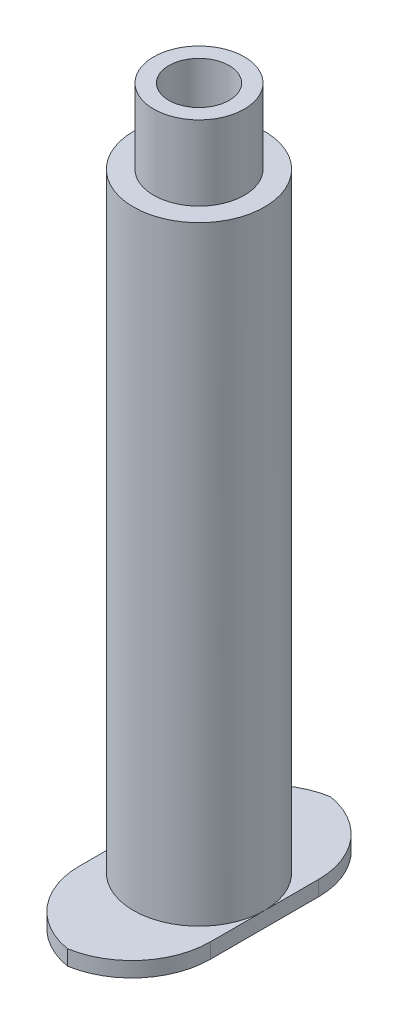
ISO-10303-21;
HEADER;
FILE_DESCRIPTION(('STEP AP214'),'2;1');
FILE_NAME('part.step','',(''),(''),'','','');
FILE_SCHEMA(('AUTOMOTIVE_DESIGN { 1 0 10303 214 1 1 1 1 }'));
ENDSEC;
DATA;
#1=APPLICATION_CONTEXT('core data for automotive mechanical design processes');
#2=APPLICATION_PROTOCOL_DEFINITION('international standard','automotive_design',2000,#1);
#3=PRODUCT_CONTEXT('',#1,'mechanical');
#4=PRODUCT('Part','Part','',(#3));
#5=PRODUCT_RELATED_PRODUCT_CATEGORY('part','',(#4));
#6=PRODUCT_DEFINITION_FORMATION('','',#4);
#7=PRODUCT_DEFINITION_CONTEXT('part definition',#1,'design');
#8=PRODUCT_DEFINITION('design','',#6,#7);
#9=PRODUCT_DEFINITION_SHAPE('','',#8);
#10=(LENGTH_UNIT() NAMED_UNIT(*) SI_UNIT(.MILLI.,.METRE.));
#11=(NAMED_UNIT(*) PLANE_ANGLE_UNIT() SI_UNIT($,.RADIAN.));
#12=(NAMED_UNIT(*) SI_UNIT($,.STERADIAN.) SOLID_ANGLE_UNIT());
#13=UNCERTAINTY_MEASURE_WITH_UNIT(LENGTH_MEASURE(1.E-05),#10,'distance_accuracy_value','');
#14=(GEOMETRIC_REPRESENTATION_CONTEXT(3) GLOBAL_UNCERTAINTY_ASSIGNED_CONTEXT((#13)) GLOBAL_UNIT_ASSIGNED_CONTEXT((#10,
#11,#12)) REPRESENTATION_CONTEXT('',''));
#15=CARTESIAN_POINT('',(0.,0.,0.));
#16=DIRECTION('',(0.,0.,1.));
#17=DIRECTION('',(1.,0.,0.));
#18=AXIS2_PLACEMENT_3D('',#15,#16,#17);
#19=CARTESIAN_POINT('',(0.,62.,0.));
#20=DIRECTION('',(0.,-1.,0.));
#21=DIRECTION('',(0.,0.,-1.));
#22=AXIS2_PLACEMENT_3D('',#19,#20,#21);
#23=CYLINDRICAL_SURFACE('',#22,6.67);
#24=CARTESIAN_POINT('',(0.,62.,0.));
#25=DIRECTION('',(0.,1.,0.));
#26=DIRECTION('',(0.,0.,1.));
#27=AXIS2_PLACEMENT_3D('',#24,#25,#26);
#28=CIRCLE('',#27,6.67);
#29=CARTESIAN_POINT('',(0.,62.,6.67));
#30=VERTEX_POINT('',#29);
#31=EDGE_CURVE('E118',#30,#30,#28,.T.);
#32=ORIENTED_EDGE('',*,*,#31,.F.);
#33=EDGE_LOOP('',(#32));
#34=FACE_BOUND('',#33,.T.);
#35=CARTESIAN_POINT('',(0.,0.,0.));
#36=DIRECTION('',(0.,1.,0.));
#37=DIRECTION('',(0.,0.,1.));
#38=AXIS2_PLACEMENT_3D('',#35,#36,#37);
#39=CIRCLE('',#38,6.67);
#40=CARTESIAN_POINT('',(6.67,0.,0.));
#41=VERTEX_POINT('',#40);
#42=CARTESIAN_POINT('',(-6.67,0.,0.));
#43=VERTEX_POINT('',#42);
#44=EDGE_CURVE('E109',#41,#43,#39,.T.);
#45=ORIENTED_EDGE('',*,*,#44,.T.);
#46=EDGE_CURVE('E103',#43,#41,#39,.T.);
#47=ORIENTED_EDGE('',*,*,#46,.T.);
#48=EDGE_LOOP('',(#45,#47));
#49=FACE_BOUND('',#48,.T.);
#50=ADVANCED_FACE('F33',(#34,#49),#23,.T.);
#51=CARTESIAN_POINT('',(0.,62.,0.));
#52=DIRECTION('',(0.,1.,0.));
#53=DIRECTION('',(0.,0.,1.));
#54=AXIS2_PLACEMENT_3D('',#51,#52,#53);
#55=PLANE('',#54);
#56=CARTESIAN_POINT('',(0.,62.,0.));
#57=DIRECTION('',(0.,1.,0.));
#58=DIRECTION('',(0.,0.,1.));
#59=AXIS2_PLACEMENT_3D('',#56,#57,#58);
#60=CIRCLE('',#59,4.61);
#61=CARTESIAN_POINT('',(0.,62.,-4.61));
#62=VERTEX_POINT('',#61);
#63=EDGE_CURVE('E120',#62,#62,#60,.T.);
#64=ORIENTED_EDGE('',*,*,#63,.F.);
#65=EDGE_LOOP('',(#64));
#66=FACE_BOUND('',#65,.T.);
#67=ORIENTED_EDGE('',*,*,#31,.T.);
#68=EDGE_LOOP('',(#67));
#69=FACE_BOUND('',#68,.T.);
#70=ADVANCED_FACE('F187',(#66,#69),#55,.T.);
#71=CARTESIAN_POINT('',(0.,69.6,0.));
#72=DIRECTION('',(0.,-1.,0.));
#73=DIRECTION('',(0.,0.,-1.));
#74=AXIS2_PLACEMENT_3D('',#71,#72,#73);
#75=CYLINDRICAL_SURFACE('',#74,4.61);
#76=CARTESIAN_POINT('',(0.,69.6,0.));
#77=DIRECTION('',(0.,1.,0.));
#78=DIRECTION('',(0.,0.,1.));
#79=AXIS2_PLACEMENT_3D('',#76,#77,#78);
#80=CIRCLE('',#79,4.61);
#81=CARTESIAN_POINT('',(0.,69.6,-4.61));
#82=VERTEX_POINT('',#81);
#83=EDGE_CURVE('E110',#82,#82,#80,.T.);
#84=CARTESIAN_POINT('',(0.,69.6,-4.61));
#85=CARTESIAN_POINT('',(0.,69.5208333333333,-4.61));
#86=CARTESIAN_POINT('',(0.,69.4416666666666,-4.61));
#87=CARTESIAN_POINT('',(0.,69.2833333333333,-4.61));
#88=CARTESIAN_POINT('',(0.,69.2041666666667,-4.61));
#89=CARTESIAN_POINT('',(0.,69.0458333333333,-4.61));
#90=CARTESIAN_POINT('',(0.,68.9666666666667,-4.61));
#91=CARTESIAN_POINT('',(0.,68.8083333333333,-4.61));
#92=CARTESIAN_POINT('',(0.,68.7291666666667,-4.61));
#93=CARTESIAN_POINT('',(0.,68.5708333333333,-4.61));
#94=CARTESIAN_POINT('',(0.,68.4916666666667,-4.61));
#95=CARTESIAN_POINT('',(0.,68.3333333333333,-4.61));
#96=CARTESIAN_POINT('',(0.,68.2541666666667,-4.61));
#97=CARTESIAN_POINT('',(0.,68.0958333333333,-4.61));
#98=CARTESIAN_POINT('',(0.,68.0166666666667,-4.61));
#99=CARTESIAN_POINT('',(0.,67.8583333333333,-4.61));
#100=CARTESIAN_POINT('',(0.,67.7791666666667,-4.61));
#101=CARTESIAN_POINT('',(0.,67.6208333333333,-4.61));
#102=CARTESIAN_POINT('',(0.,67.5416666666667,-4.61));
#103=CARTESIAN_POINT('',(0.,67.3833333333333,-4.61));
#104=CARTESIAN_POINT('',(0.,67.3041666666667,-4.61));
#105=CARTESIAN_POINT('',(0.,67.1458333333333,-4.61));
#106=CARTESIAN_POINT('',(0.,67.0666666666667,-4.61));
#107=CARTESIAN_POINT('',(0.,66.9083333333333,-4.61));
#108=CARTESIAN_POINT('',(0.,66.8291666666667,-4.61));
#109=CARTESIAN_POINT('',(0.,66.6708333333333,-4.61));
#110=CARTESIAN_POINT('',(0.,66.5916666666667,-4.61));
#111=CARTESIAN_POINT('',(0.,66.4333333333333,-4.61));
#112=CARTESIAN_POINT('',(0.,66.3541666666667,-4.61));
#113=CARTESIAN_POINT('',(0.,66.1958333333333,-4.61));
#114=CARTESIAN_POINT('',(0.,66.1166666666667,-4.61));
#115=CARTESIAN_POINT('',(0.,65.9583333333333,-4.61));
#116=CARTESIAN_POINT('',(0.,65.8791666666666,-4.61));
#117=CARTESIAN_POINT('',(0.,65.7208333333333,-4.61));
#118=CARTESIAN_POINT('',(0.,65.6416666666667,-4.61));
#119=CARTESIAN_POINT('',(0.,65.4833333333333,-4.61));
#120=CARTESIAN_POINT('',(0.,65.4041666666667,-4.61));
#121=CARTESIAN_POINT('',(0.,65.2458333333333,-4.61));
#122=CARTESIAN_POINT('',(0.,65.1666666666667,-4.61));
#123=CARTESIAN_POINT('',(0.,65.0083333333333,-4.61));
#124=CARTESIAN_POINT('',(0.,64.9291666666667,-4.61));
#125=CARTESIAN_POINT('',(0.,64.7708333333333,-4.61));
#126=CARTESIAN_POINT('',(0.,64.6916666666667,-4.61));
#127=CARTESIAN_POINT('',(0.,64.5333333333333,-4.61));
#128=CARTESIAN_POINT('',(0.,64.4541666666667,-4.61));
#129=CARTESIAN_POINT('',(0.,64.2958333333333,-4.61));
#130=CARTESIAN_POINT('',(0.,64.2166666666667,-4.61));
#131=CARTESIAN_POINT('',(0.,64.0583333333333,-4.61));
#132=CARTESIAN_POINT('',(0.,63.9791666666667,-4.61));
#133=CARTESIAN_POINT('',(0.,63.8208333333333,-4.61));
#134=CARTESIAN_POINT('',(0.,63.7416666666667,-4.61));
#135=CARTESIAN_POINT('',(0.,63.5833333333333,-4.61));
#136=CARTESIAN_POINT('',(0.,63.5041666666667,-4.61));
#137=CARTESIAN_POINT('',(0.,63.3458333333333,-4.61));
#138=CARTESIAN_POINT('',(0.,63.2666666666667,-4.61));
#139=CARTESIAN_POINT('',(0.,63.1083333333333,-4.61));
#140=CARTESIAN_POINT('',(0.,63.0291666666667,-4.61));
#141=CARTESIAN_POINT('',(0.,62.8708333333333,-4.61));
#142=CARTESIAN_POINT('',(0.,62.7916666666667,-4.61));
#143=CARTESIAN_POINT('',(0.,62.6333333333333,-4.61));
#144=CARTESIAN_POINT('',(0.,62.5541666666667,-4.61));
#145=CARTESIAN_POINT('',(0.,62.3958333333333,-4.61));
#146=CARTESIAN_POINT('',(0.,62.3166666666667,-4.61));
#147=CARTESIAN_POINT('',(0.,62.1583333333333,-4.61));
#148=CARTESIAN_POINT('',(0.,62.0791666666667,-4.61));
#149=CARTESIAN_POINT('',(0.,62.,-4.61));
#150=B_SPLINE_CURVE_WITH_KNOTS('',3,(#84,#85,#86,#87,#88,#89,#90,#91,#92,#93,#94,#95,#96,#97,
#98,#99,#100,#101,#102,#103,#104,#105,#106,#107,#108,#109,#110,#111,#112,#113,#114,#115,#116,
#117,#118,#119,#120,#121,#122,#123,#124,#125,#126,#127,#128,#129,#130,#131,#132,#133,#134,#135,
#136,#137,#138,#139,#140,#141,#142,#143,#144,#145,#146,#147,#148,#149),.UNSPECIFIED.,.F.,.F.,(4,
2,2,2,2,2,2,2,2,2,2,2,2,2,2,2,2,2,2,2,2,2,2,2,2,2,2,2,2,2,2,2,4),(0.,0.237499999999988,
0.474999999999989,0.712499999999991,0.949999999999993,1.18749999999999,1.425,1.6625,
1.89999999999999,2.13749999999999,2.37499999999999,2.61249999999999,2.84999999999999,
3.08749999999999,3.32499999999999,3.5625,3.79999999999998,4.03749999999999,4.27499999999999,
4.51249999999999,4.74999999999999,4.98749999999999,5.22499999999999,5.4625,5.69999999999998,
5.93749999999998,6.17499999999999,6.41249999999999,6.64999999999999,6.88749999999999,
7.12499999999999,7.36249999999999,7.59999999999999),.UNSPECIFIED.);
#151=EDGE_CURVE('BSEAM185',#82,#62,#150,.T.);
#152=ORIENTED_EDGE('',*,*,#83,.F.);
#153=ORIENTED_EDGE('',*,*,#63,.T.);
#154=ORIENTED_EDGE('',*,*,#151,.T.);
#155=ORIENTED_EDGE('',*,*,#151,.F.);
#156=EDGE_LOOP('',(#152,#154,#153,#155));
#157=FACE_BOUND('',#156,.T.);
#158=ADVANCED_FACE('F185',(#157),#75,.T.);
#159=CARTESIAN_POINT('',(0.,69.6,0.));
#160=DIRECTION('',(0.,1.,0.));
#161=DIRECTION('',(0.,0.,1.));
#162=AXIS2_PLACEMENT_3D('',#159,#160,#161);
#163=PLANE('',#162);
#164=CARTESIAN_POINT('',(0.,69.6,0.));
#165=DIRECTION('',(0.,1.,0.));
#166=DIRECTION('',(0.,0.,1.));
#167=AXIS2_PLACEMENT_3D('',#164,#165,#166);
#168=CIRCLE('',#167,3.07);
#169=CARTESIAN_POINT('',(0.,69.6,3.07));
#170=VERTEX_POINT('',#169);
#171=EDGE_CURVE('E128',#170,#170,#168,.T.);
#172=ORIENTED_EDGE('',*,*,#171,.F.);
#173=EDGE_LOOP('',(#172));
#174=FACE_BOUND('',#173,.T.);
#175=ORIENTED_EDGE('',*,*,#83,.T.);
#176=EDGE_LOOP('',(#175));
#177=FACE_BOUND('',#176,.T.);
#178=ADVANCED_FACE('F272',(#174,#177),#163,.T.);
#179=CARTESIAN_POINT('',(0.,60.6,0.));
#180=DIRECTION('',(0.,-1.,0.));
#181=DIRECTION('',(0.,0.,-1.));
#182=AXIS2_PLACEMENT_3D('',#179,#180,#181);
#183=CYLINDRICAL_SURFACE('',#182,5.13);
#184=CARTESIAN_POINT('',(0.,60.6,0.));
#185=DIRECTION('',(0.,-1.,0.));
#186=DIRECTION('',(0.,0.,-1.));
#187=AXIS2_PLACEMENT_3D('',#184,#185,#186);
#188=CIRCLE('',#187,5.13);
#189=CARTESIAN_POINT('',(0.,60.6,-5.13));
#190=VERTEX_POINT('',#189);
#191=EDGE_CURVE('E127',#190,#190,#188,.T.);
#192=CARTESIAN_POINT('',(0.,-1.54,0.));
#193=DIRECTION('',(0.,-1.,0.));
#194=DIRECTION('',(0.,0.,-1.));
#195=AXIS2_PLACEMENT_3D('',#192,#193,#194);
#196=CIRCLE('',#195,5.13);
#197=CARTESIAN_POINT('',(0.,-1.54000000000001,-5.13));
#198=VERTEX_POINT('',#197);
#199=EDGE_CURVE('E149',#198,#198,#196,.T.);
#200=CARTESIAN_POINT('',(0.,60.6,-5.13));
#201=CARTESIAN_POINT('',(0.,59.9527083333334,-5.13));
#202=CARTESIAN_POINT('',(0.,59.3054166666667,-5.13));
#203=CARTESIAN_POINT('',(0.,58.0108333333334,-5.13));
#204=CARTESIAN_POINT('',(0.,57.3635416666667,-5.13));
#205=CARTESIAN_POINT('',(0.,56.0689583333334,-5.13));
#206=CARTESIAN_POINT('',(0.,55.4216666666667,-5.13));
#207=CARTESIAN_POINT('',(0.,54.1270833333334,-5.13));
#208=CARTESIAN_POINT('',(0.,53.4797916666667,-5.13));
#209=CARTESIAN_POINT('',(0.,52.1852083333334,-5.13));
#210=CARTESIAN_POINT('',(0.,51.5379166666667,-5.13));
#211=CARTESIAN_POINT('',(0.,50.2433333333334,-5.13));
#212=CARTESIAN_POINT('',(0.,49.5960416666667,-5.13));
#213=CARTESIAN_POINT('',(0.,48.3014583333334,-5.13));
#214=CARTESIAN_POINT('',(0.,47.6541666666667,-5.13));
#215=CARTESIAN_POINT('',(0.,46.3595833333334,-5.13));
#216=CARTESIAN_POINT('',(0.,45.7122916666667,-5.13));
#217=CARTESIAN_POINT('',(0.,44.4177083333334,-5.13));
#218=CARTESIAN_POINT('',(0.,43.7704166666667,-5.13));
#219=CARTESIAN_POINT('',(0.,42.4758333333334,-5.13));
#220=CARTESIAN_POINT('',(0.,41.8285416666667,-5.13));
#221=CARTESIAN_POINT('',(0.,40.5339583333334,-5.13));
#222=CARTESIAN_POINT('',(0.,39.8866666666667,-5.13));
#223=CARTESIAN_POINT('',(0.,38.5920833333334,-5.13));
#224=CARTESIAN_POINT('',(0.,37.9447916666667,-5.13));
#225=CARTESIAN_POINT('',(0.,36.6502083333334,-5.13));
#226=CARTESIAN_POINT('',(0.,36.0029166666667,-5.13));
#227=CARTESIAN_POINT('',(0.,34.7083333333333,-5.13));
#228=CARTESIAN_POINT('',(0.,34.0610416666667,-5.13));
#229=CARTESIAN_POINT('',(0.,32.7664583333333,-5.13));
#230=CARTESIAN_POINT('',(0.,32.1191666666667,-5.13));
#231=CARTESIAN_POINT('',(0.,30.8245833333333,-5.13));
#232=CARTESIAN_POINT('',(0.,30.1772916666667,-5.13));
#233=CARTESIAN_POINT('',(0.,28.8827083333333,-5.13));
#234=CARTESIAN_POINT('',(0.,28.2354166666667,-5.13));
#235=CARTESIAN_POINT('',(0.,26.9408333333334,-5.13));
#236=CARTESIAN_POINT('',(0.,26.2935416666667,-5.13));
#237=CARTESIAN_POINT('',(0.,24.9989583333333,-5.13));
#238=CARTESIAN_POINT('',(0.,24.3516666666667,-5.13));
#239=CARTESIAN_POINT('',(0.,23.0570833333333,-5.13));
#240=CARTESIAN_POINT('',(0.,22.4097916666667,-5.13));
#241=CARTESIAN_POINT('',(0.,21.1152083333333,-5.13));
#242=CARTESIAN_POINT('',(0.,20.4679166666667,-5.13));
#243=CARTESIAN_POINT('',(0.,19.1733333333333,-5.13));
#244=CARTESIAN_POINT('',(0.,18.5260416666667,-5.13));
#245=CARTESIAN_POINT('',(0.,17.2314583333333,-5.13));
#246=CARTESIAN_POINT('',(0.,16.5841666666667,-5.13));
#247=CARTESIAN_POINT('',(0.,15.2895833333333,-5.13));
#248=CARTESIAN_POINT('',(0.,14.6422916666667,-5.13));
#249=CARTESIAN_POINT('',(0.,13.3477083333333,-5.13));
#250=CARTESIAN_POINT('',(0.,12.7004166666667,-5.13));
#251=CARTESIAN_POINT('',(0.,11.4058333333333,-5.13));
#252=CARTESIAN_POINT('',(0.,10.7585416666667,-5.13));
#253=CARTESIAN_POINT('',(0.,9.46395833333333,-5.13));
#254=CARTESIAN_POINT('',(0.,8.81666666666667,-5.13));
#255=CARTESIAN_POINT('',(0.,7.52208333333333,-5.13));
#256=CARTESIAN_POINT('',(0.,6.87479166666666,-5.13));
#257=CARTESIAN_POINT('',(0.,5.58020833333333,-5.13));
#258=CARTESIAN_POINT('',(0.,4.93291666666667,-5.13));
#259=CARTESIAN_POINT('',(0.,3.63833333333333,-5.13));
#260=CARTESIAN_POINT('',(0.,2.99104166666667,-5.13));
#261=CARTESIAN_POINT('',(0.,1.69645833333333,-5.13));
#262=CARTESIAN_POINT('',(0.,1.04916666666666,-5.13));
#263=CARTESIAN_POINT('',(0.,-0.245416666666672,-5.13));
#264=CARTESIAN_POINT('',(0.,-0.892708333333339,-5.13));
#265=CARTESIAN_POINT('',(0.,-1.54000000000001,-5.13));
#266=B_SPLINE_CURVE_WITH_KNOTS('',3,(#200,#201,#202,#203,#204,#205,#206,#207,#208,#209,#210,
#211,#212,#213,#214,#215,#216,#217,#218,#219,#220,#221,#222,#223,#224,#225,#226,#227,#228,#229,
#230,#231,#232,#233,#234,#235,#236,#237,#238,#239,#240,#241,#242,#243,#244,#245,#246,#247,#248,
#249,#250,#251,#252,#253,#254,#255,#256,#257,#258,#259,#260,#261,#262,#263,#264,#265),
.UNSPECIFIED.,.F.,.F.,(4,2,2,2,2,2,2,2,2,2,2,2,2,2,2,2,2,2,2,2,2,2,2,2,2,2,2,2,2,2,2,2,4),(0.,
1.941875,3.88375000000001,5.82562500000001,7.76750000000001,9.70937500000001,11.65125,13.593125,
15.535,17.476875,19.41875,21.360625,23.3025,25.244375,27.18625,29.128125,31.07,33.011875,
34.95375,36.895625,38.8375,40.779375,42.72125,44.663125,46.605,48.546875,50.48875,52.430625,
54.3725,56.314375,58.25625,60.198125,62.14),.UNSPECIFIED.);
#267=EDGE_CURVE('BSEAM264',#190,#198,#266,.T.);
#268=ORIENTED_EDGE('',*,*,#191,.F.);
#269=ORIENTED_EDGE('',*,*,#199,.T.);
#270=ORIENTED_EDGE('',*,*,#267,.T.);
#271=ORIENTED_EDGE('',*,*,#267,.F.);
#272=EDGE_LOOP('',(#268,#270,#269,#271));
#273=FACE_BOUND('',#272,.T.);
#274=ADVANCED_FACE('F264',(#273),#183,.F.);
#275=CARTESIAN_POINT('',(0.,60.6,0.));
#276=DIRECTION('',(0.,-1.,0.));
#277=DIRECTION('',(0.,0.,-1.));
#278=AXIS2_PLACEMENT_3D('',#275,#276,#277);
#279=PLANE('',#278);
#280=CARTESIAN_POINT('',(0.,60.6,0.));
#281=DIRECTION('',(0.,-1.,0.));
#282=DIRECTION('',(0.,0.,-1.));
#283=AXIS2_PLACEMENT_3D('',#280,#281,#282);
#284=CIRCLE('',#283,3.07);
#285=CARTESIAN_POINT('',(0.,60.6,3.07));
#286=VERTEX_POINT('',#285);
#287=EDGE_CURVE('E124',#286,#286,#284,.T.);
#288=ORIENTED_EDGE('',*,*,#287,.F.);
#289=EDGE_LOOP('',(#288));
#290=FACE_BOUND('',#289,.T.);
#291=ORIENTED_EDGE('',*,*,#191,.T.);
#292=EDGE_LOOP('',(#291));
#293=FACE_BOUND('',#292,.T.);
#294=ADVANCED_FACE('F256',(#290,#293),#279,.T.);
#295=CARTESIAN_POINT('',(0.,8.99999999999997,0.));
#296=DIRECTION('',(0.,1.,0.));
#297=DIRECTION('',(0.,0.,1.));
#298=AXIS2_PLACEMENT_3D('',#295,#296,#297);
#299=CYLINDRICAL_SURFACE('',#298,3.07);
#300=CARTESIAN_POINT('',(0.,60.6,3.07));
#301=CARTESIAN_POINT('',(0.,60.69375,3.07));
#302=CARTESIAN_POINT('',(0.,60.7875,3.07));
#303=CARTESIAN_POINT('',(0.,60.975,3.07));
#304=CARTESIAN_POINT('',(0.,61.06875,3.07));
#305=CARTESIAN_POINT('',(0.,61.25625,3.07));
#306=CARTESIAN_POINT('',(0.,61.35,3.07));
#307=CARTESIAN_POINT('',(0.,61.5375,3.07));
#308=CARTESIAN_POINT('',(0.,61.63125,3.07));
#309=CARTESIAN_POINT('',(0.,61.81875,3.07));
#310=CARTESIAN_POINT('',(0.,61.9125,3.07));
#311=CARTESIAN_POINT('',(0.,62.1,3.07));
#312=CARTESIAN_POINT('',(0.,62.19375,3.07));
#313=CARTESIAN_POINT('',(0.,62.38125,3.07));
#314=CARTESIAN_POINT('',(0.,62.475,3.07));
#315=CARTESIAN_POINT('',(0.,62.6625,3.07));
#316=CARTESIAN_POINT('',(0.,62.75625,3.07));
#317=CARTESIAN_POINT('',(0.,62.94375,3.07));
#318=CARTESIAN_POINT('',(0.,63.0375,3.07));
#319=CARTESIAN_POINT('',(0.,63.225,3.07));
#320=CARTESIAN_POINT('',(0.,63.31875,3.07));
#321=CARTESIAN_POINT('',(0.,63.50625,3.07));
#322=CARTESIAN_POINT('',(0.,63.6,3.07));
#323=CARTESIAN_POINT('',(0.,63.7875,3.07));
#324=CARTESIAN_POINT('',(0.,63.88125,3.07));
#325=CARTESIAN_POINT('',(0.,64.06875,3.07));
#326=CARTESIAN_POINT('',(0.,64.1625,3.07));
#327=CARTESIAN_POINT('',(0.,64.35,3.07));
#328=CARTESIAN_POINT('',(0.,64.44375,3.07));
#329=CARTESIAN_POINT('',(0.,64.63125,3.07));
#330=CARTESIAN_POINT('',(0.,64.725,3.07));
#331=CARTESIAN_POINT('',(0.,64.9125,3.07));
#332=CARTESIAN_POINT('',(0.,65.00625,3.07));
#333=CARTESIAN_POINT('',(0.,65.19375,3.07));
#334=CARTESIAN_POINT('',(0.,65.2875,3.07));
#335=CARTESIAN_POINT('',(0.,65.475,3.07));
#336=CARTESIAN_POINT('',(0.,65.56875,3.07));
#337=CARTESIAN_POINT('',(0.,65.75625,3.07));
#338=CARTESIAN_POINT('',(0.,65.85,3.07));
#339=CARTESIAN_POINT('',(0.,66.0375,3.07));
#340=CARTESIAN_POINT('',(0.,66.13125,3.07));
#341=CARTESIAN_POINT('',(0.,66.31875,3.07));
#342=CARTESIAN_POINT('',(0.,66.4125,3.07));
#343=CARTESIAN_POINT('',(0.,66.6,3.07));
#344=CARTESIAN_POINT('',(0.,66.69375,3.07));
#345=CARTESIAN_POINT('',(0.,66.88125,3.07));
#346=CARTESIAN_POINT('',(0.,66.975,3.07));
#347=CARTESIAN_POINT('',(0.,67.1625,3.07));
#348=CARTESIAN_POINT('',(0.,67.25625,3.07));
#349=CARTESIAN_POINT('',(0.,67.44375,3.07));
#350=CARTESIAN_POINT('',(0.,67.5375,3.07));
#351=CARTESIAN_POINT('',(0.,67.725,3.07));
#352=CARTESIAN_POINT('',(0.,67.81875,3.07));
#353=CARTESIAN_POINT('',(0.,68.00625,3.07));
#354=CARTESIAN_POINT('',(0.,68.1,3.07));
#355=CARTESIAN_POINT('',(0.,68.2875,3.07));
#356=CARTESIAN_POINT('',(0.,68.38125,3.07));
#357=CARTESIAN_POINT('',(0.,68.56875,3.07));
#358=CARTESIAN_POINT('',(0.,68.6625,3.07));
#359=CARTESIAN_POINT('',(0.,68.85,3.07));
#360=CARTESIAN_POINT('',(0.,68.94375,3.07));
#361=CARTESIAN_POINT('',(0.,69.13125,3.07));
#362=CARTESIAN_POINT('',(0.,69.225,3.07));
#363=CARTESIAN_POINT('',(0.,69.4125,3.07));
#364=CARTESIAN_POINT('',(0.,69.50625,3.07));
#365=CARTESIAN_POINT('',(0.,69.6,3.07));
#366=B_SPLINE_CURVE_WITH_KNOTS('',3,(#300,#301,#302,#303,#304,#305,#306,#307,#308,#309,#310,
#311,#312,#313,#314,#315,#316,#317,#318,#319,#320,#321,#322,#323,#324,#325,#326,#327,#328,#329,
#330,#331,#332,#333,#334,#335,#336,#337,#338,#339,#340,#341,#342,#343,#344,#345,#346,#347,#348,
#349,#350,#351,#352,#353,#354,#355,#356,#357,#358,#359,#360,#361,#362,#363,#364,#365),
.UNSPECIFIED.,.F.,.F.,(4,2,2,2,2,2,2,2,2,2,2,2,2,2,2,2,2,2,2,2,2,2,2,2,2,2,2,2,2,2,2,2,4),(0.,
0.281249999999997,0.562499999999994,0.843749999999997,1.12499999999999,1.40624999999999,
1.68749999999999,1.96875,2.24999999999998,2.53124999999999,2.81249999999997,3.09374999999999,
3.37499999999998,3.65624999999998,3.93749999999999,4.21874999999997,4.49999999999998,
4.78124999999997,5.06249999999998,5.34374999999997,5.62499999999997,5.90624999999997,
6.18749999999996,6.46874999999997,6.74999999999996,7.03124999999997,7.31249999999995,
7.59374999999996,7.87499999999996,8.15624999999996,8.43749999999997,8.71874999999995,
8.99999999999996),.UNSPECIFIED.);
#367=EDGE_CURVE('BSEAM249',#286,#170,#366,.T.);
#368=ORIENTED_EDGE('',*,*,#287,.T.);
#369=ORIENTED_EDGE('',*,*,#171,.T.);
#370=ORIENTED_EDGE('',*,*,#367,.T.);
#371=ORIENTED_EDGE('',*,*,#367,.F.);
#372=EDGE_LOOP('',(#368,#370,#369,#371));
#373=FACE_BOUND('',#372,.T.);
#374=ADVANCED_FACE('F249',(#373),#299,.F.);
#375=CARTESIAN_POINT('',(0.,0.,0.));
#376=DIRECTION('',(0.,-1.,0.));
#377=DIRECTION('',(0.,0.,-1.));
#378=AXIS2_PLACEMENT_3D('',#375,#376,#377);
#379=PLANE('',#378);
#380=CARTESIAN_POINT('',(-1.33,0.,-5.49999999999999));
#381=DIRECTION('',(0.,-1.,0.));
#382=DIRECTION('',(0.,0.,-1.));
#383=AXIS2_PLACEMENT_3D('',#380,#381,#382);
#384=CIRCLE('',#383,8.);
#385=CARTESIAN_POINT('',(6.67,0.,-5.49999999999999));
#386=VERTEX_POINT('',#385);
#387=CARTESIAN_POINT('',(0.,0.,-13.3886690892697));
#388=VERTEX_POINT('',#387);
#389=EDGE_CURVE('E129',#386,#388,#384,.F.);
#390=ORIENTED_EDGE('',*,*,#389,.T.);
#391=CARTESIAN_POINT('',(1.33,0.,-5.5));
#392=DIRECTION('',(0.,-1.,0.));
#393=DIRECTION('',(0.,0.,-1.));
#394=AXIS2_PLACEMENT_3D('',#391,#392,#393);
#395=CIRCLE('',#394,8.);
#396=CARTESIAN_POINT('',(-6.67,0.,-5.5));
#397=VERTEX_POINT('',#396);
#398=EDGE_CURVE('E116',#388,#397,#395,.F.);
#399=ORIENTED_EDGE('',*,*,#398,.T.);
#400=DIRECTION('',(0.,0.,-1.));
#401=VECTOR('',#400,1.);
#402=CARTESIAN_POINT('',(-6.67,0.,13.5));
#403=LINE('',#402,#401);
#404=EDGE_CURVE('E95',#43,#397,#403,.T.);
#405=ORIENTED_EDGE('',*,*,#404,.F.);
#406=ORIENTED_EDGE('',*,*,#44,.F.);
#407=DIRECTION('',(0.,0.,1.));
#408=VECTOR('',#407,1.);
#409=CARTESIAN_POINT('',(6.67,0.,13.5));
#410=LINE('',#409,#408);
#411=EDGE_CURVE('E117',#386,#41,#410,.T.);
#412=ORIENTED_EDGE('',*,*,#411,.F.);
#413=EDGE_LOOP('',(#390,#399,#405,#406,#412));
#414=FACE_BOUND('',#413,.T.);
#415=ADVANCED_FACE('F113',(#414),#379,.F.);
#416=CARTESIAN_POINT('',(0.,-1.54,0.));
#417=DIRECTION('',(0.,-1.,0.));
#418=DIRECTION('',(0.,0.,-1.));
#419=AXIS2_PLACEMENT_3D('',#416,#417,#418);
#420=PLANE('',#419);
#421=DIRECTION('',(0.,0.,-1.));
#422=VECTOR('',#421,1.);
#423=CARTESIAN_POINT('',(-6.67,-1.54,13.5));
#424=LINE('',#423,#422);
#425=CARTESIAN_POINT('',(-6.67,-1.54,5.5));
#426=VERTEX_POINT('',#425);
#427=CARTESIAN_POINT('',(-6.67,-1.54,-5.5));
#428=VERTEX_POINT('',#427);
#429=EDGE_CURVE('E172',#426,#428,#424,.T.);
#430=ORIENTED_EDGE('',*,*,#429,.T.);
#431=CARTESIAN_POINT('',(1.33,-1.54,-5.5));
#432=DIRECTION('',(0.,-1.,0.));
#433=DIRECTION('',(0.,0.,-1.));
#434=AXIS2_PLACEMENT_3D('',#431,#432,#433);
#435=CIRCLE('',#434,8.);
#436=CARTESIAN_POINT('',(0.,-1.54,-13.3886690892697));
#437=VERTEX_POINT('',#436);
#438=EDGE_CURVE('E141',#428,#437,#435,.T.);
#439=ORIENTED_EDGE('',*,*,#438,.T.);
#440=CARTESIAN_POINT('',(-1.33,-1.54,-5.49999999999999));
#441=DIRECTION('',(0.,-1.,0.));
#442=DIRECTION('',(0.,0.,-1.));
#443=AXIS2_PLACEMENT_3D('',#440,#441,#442);
#444=CIRCLE('',#443,8.);
#445=CARTESIAN_POINT('',(6.67,-1.54,-5.49999999999999));
#446=VERTEX_POINT('',#445);
#447=EDGE_CURVE('E139',#437,#446,#444,.T.);
#448=ORIENTED_EDGE('',*,*,#447,.T.);
#449=DIRECTION('',(0.,0.,1.));
#450=VECTOR('',#449,1.);
#451=CARTESIAN_POINT('',(6.67,-1.54,13.5));
#452=LINE('',#451,#450);
#453=CARTESIAN_POINT('',(6.67,-1.54,5.5));
#454=VERTEX_POINT('',#453);
#455=EDGE_CURVE('E100',#446,#454,#452,.T.);
#456=ORIENTED_EDGE('',*,*,#455,.T.);
#457=CARTESIAN_POINT('',(-1.33,-1.54,5.5));
#458=DIRECTION('',(0.,-1.,0.));
#459=DIRECTION('',(0.,0.,-1.));
#460=AXIS2_PLACEMENT_3D('',#457,#458,#459);
#461=CIRCLE('',#460,8.);
#462=CARTESIAN_POINT('',(0.,-1.54,13.3886690892697));
#463=VERTEX_POINT('',#462);
#464=EDGE_CURVE('E135',#454,#463,#461,.T.);
#465=ORIENTED_EDGE('',*,*,#464,.T.);
#466=CARTESIAN_POINT('',(1.33,-1.54,5.5));
#467=DIRECTION('',(0.,-1.,0.));
#468=DIRECTION('',(0.,0.,-1.));
#469=AXIS2_PLACEMENT_3D('',#466,#467,#468);
#470=CIRCLE('',#469,8.);
#471=EDGE_CURVE('E137',#463,#426,#470,.T.);
#472=ORIENTED_EDGE('',*,*,#471,.T.);
#473=EDGE_LOOP('',(#430,#439,#448,#456,#465,#472));
#474=FACE_BOUND('',#473,.T.);
#475=ORIENTED_EDGE('',*,*,#199,.F.);
#476=EDGE_LOOP('',(#475));
#477=FACE_BOUND('',#476,.T.);
#478=ADVANCED_FACE('F169',(#474,#477),#420,.T.);
#479=CARTESIAN_POINT('',(-6.67,0.,5.5));
#480=VERTEX_POINT('',#479);
#481=EDGE_CURVE('E90',#480,#43,#403,.T.);
#482=ORIENTED_EDGE('',*,*,#481,.F.);
#483=CARTESIAN_POINT('',(1.33,0.,5.5));
#484=DIRECTION('',(0.,-1.,0.));
#485=DIRECTION('',(0.,0.,-1.));
#486=AXIS2_PLACEMENT_3D('',#483,#484,#485);
#487=CIRCLE('',#486,8.);
#488=CARTESIAN_POINT('',(0.,0.,13.3886690892697));
#489=VERTEX_POINT('',#488);
#490=EDGE_CURVE('E11',#480,#489,#487,.F.);
#491=ORIENTED_EDGE('',*,*,#490,.T.);
#492=CARTESIAN_POINT('',(-1.33,0.,5.5));
#493=DIRECTION('',(0.,-1.,0.));
#494=DIRECTION('',(0.,0.,-1.));
#495=AXIS2_PLACEMENT_3D('',#492,#493,#494);
#496=CIRCLE('',#495,8.);
#497=CARTESIAN_POINT('',(6.67,0.,5.5));
#498=VERTEX_POINT('',#497);
#499=EDGE_CURVE('E42',#489,#498,#496,.F.);
#500=ORIENTED_EDGE('',*,*,#499,.T.);
#501=EDGE_CURVE('E105',#41,#498,#410,.T.);
#502=ORIENTED_EDGE('',*,*,#501,.F.);
#503=ORIENTED_EDGE('',*,*,#46,.F.);
#504=EDGE_LOOP('',(#482,#491,#500,#502,#503));
#505=FACE_BOUND('',#504,.T.);
#506=ADVANCED_FACE('F104',(#505),#379,.F.);
#507=CARTESIAN_POINT('',(6.67,-1.54,13.5));
#508=DIRECTION('',(-1.,0.,0.));
#509=DIRECTION('',(0.,0.,1.));
#510=AXIS2_PLACEMENT_3D('',#507,#508,#509);
#511=PLANE('',#510);
#512=ORIENTED_EDGE('',*,*,#455,.F.);
#513=DIRECTION('',(0.,1.,0.));
#514=VECTOR('',#513,1.);
#515=CARTESIAN_POINT('',(6.67,-1.54,-5.49999999999999));
#516=LINE('',#515,#514);
#517=EDGE_CURVE('E145',#446,#386,#516,.T.);
#518=ORIENTED_EDGE('',*,*,#517,.T.);
#519=ORIENTED_EDGE('',*,*,#411,.T.);
#520=ORIENTED_EDGE('',*,*,#501,.T.);
#521=DIRECTION('',(0.,1.,0.));
#522=VECTOR('',#521,1.);
#523=CARTESIAN_POINT('',(6.67,-1.54,5.5));
#524=LINE('',#523,#522);
#525=EDGE_CURVE('E143',#498,#454,#524,.F.);
#526=ORIENTED_EDGE('',*,*,#525,.T.);
#527=EDGE_LOOP('',(#512,#518,#519,#520,#526));
#528=FACE_BOUND('',#527,.T.);
#529=ADVANCED_FACE('F165',(#528),#511,.F.);
#530=CARTESIAN_POINT('',(-6.67,-1.54,13.5));
#531=DIRECTION('',(1.,0.,0.));
#532=DIRECTION('',(0.,0.,-1.));
#533=AXIS2_PLACEMENT_3D('',#530,#531,#532);
#534=PLANE('',#533);
#535=ORIENTED_EDGE('',*,*,#404,.T.);
#536=DIRECTION('',(0.,1.,0.));
#537=VECTOR('',#536,1.);
#538=CARTESIAN_POINT('',(-6.67,-1.54,-5.5));
#539=LINE('',#538,#537);
#540=EDGE_CURVE('E133',#397,#428,#539,.F.);
#541=ORIENTED_EDGE('',*,*,#540,.T.);
#542=ORIENTED_EDGE('',*,*,#429,.F.);
#543=DIRECTION('',(0.,1.,0.));
#544=VECTOR('',#543,1.);
#545=CARTESIAN_POINT('',(-6.67,-1.54,5.5));
#546=LINE('',#545,#544);
#547=EDGE_CURVE('E99',#426,#480,#546,.T.);
#548=ORIENTED_EDGE('',*,*,#547,.T.);
#549=ORIENTED_EDGE('',*,*,#481,.T.);
#550=EDGE_LOOP('',(#535,#541,#542,#548,#549));
#551=FACE_BOUND('',#550,.T.);
#552=ADVANCED_FACE('F92',(#551),#534,.F.);
#553=CARTESIAN_POINT('',(-1.33,-1.54,-5.49999999999999));
#554=DIRECTION('',(0.,1.,0.));
#555=DIRECTION('',(0.,0.,1.));
#556=AXIS2_PLACEMENT_3D('',#553,#554,#555);
#557=CYLINDRICAL_SURFACE('',#556,8.);
#558=ORIENTED_EDGE('',*,*,#517,.F.);
#559=ORIENTED_EDGE('',*,*,#447,.F.);
#560=DIRECTION('',(0.,1.,0.));
#561=VECTOR('',#560,1.);
#562=CARTESIAN_POINT('',(0.,-0.77,-13.3886690892697));
#563=LINE('',#562,#561);
#564=EDGE_CURVE('E147',#388,#437,#563,.F.);
#565=ORIENTED_EDGE('',*,*,#564,.F.);
#566=ORIENTED_EDGE('',*,*,#389,.F.);
#567=EDGE_LOOP('',(#558,#559,#565,#566));
#568=FACE_BOUND('',#567,.T.);
#569=ADVANCED_FACE('F202',(#568),#557,.T.);
#570=CARTESIAN_POINT('',(1.33,-1.54,-5.5));
#571=DIRECTION('',(0.,1.,0.));
#572=DIRECTION('',(0.,0.,1.));
#573=AXIS2_PLACEMENT_3D('',#570,#571,#572);
#574=CYLINDRICAL_SURFACE('',#573,8.);
#575=ORIENTED_EDGE('',*,*,#438,.F.);
#576=ORIENTED_EDGE('',*,*,#540,.F.);
#577=ORIENTED_EDGE('',*,*,#398,.F.);
#578=ORIENTED_EDGE('',*,*,#564,.T.);
#579=EDGE_LOOP('',(#575,#576,#577,#578));
#580=FACE_BOUND('',#579,.T.);
#581=ADVANCED_FACE('F199',(#580),#574,.T.);
#582=CARTESIAN_POINT('',(-1.33,-1.54,5.5));
#583=DIRECTION('',(0.,1.,0.));
#584=DIRECTION('',(0.,0.,1.));
#585=AXIS2_PLACEMENT_3D('',#582,#583,#584);
#586=CYLINDRICAL_SURFACE('',#585,8.);
#587=DIRECTION('',(0.,1.,0.));
#588=VECTOR('',#587,1.);
#589=CARTESIAN_POINT('',(0.,-0.77,13.3886690892697));
#590=LINE('',#589,#588);
#591=EDGE_CURVE('E37',#463,#489,#590,.T.);
#592=ORIENTED_EDGE('',*,*,#591,.F.);
#593=ORIENTED_EDGE('',*,*,#464,.F.);
#594=ORIENTED_EDGE('',*,*,#525,.F.);
#595=ORIENTED_EDGE('',*,*,#499,.F.);
#596=EDGE_LOOP('',(#592,#593,#594,#595));
#597=FACE_BOUND('',#596,.T.);
#598=ADVANCED_FACE('F35',(#597),#586,.T.);
#599=CARTESIAN_POINT('',(1.33,-1.54,5.5));
#600=DIRECTION('',(0.,1.,0.));
#601=DIRECTION('',(0.,0.,1.));
#602=AXIS2_PLACEMENT_3D('',#599,#600,#601);
#603=CYLINDRICAL_SURFACE('',#602,8.);
#604=ORIENTED_EDGE('',*,*,#471,.F.);
#605=ORIENTED_EDGE('',*,*,#591,.T.);
#606=ORIENTED_EDGE('',*,*,#490,.F.);
#607=ORIENTED_EDGE('',*,*,#547,.F.);
#608=EDGE_LOOP('',(#604,#605,#606,#607));
#609=FACE_BOUND('',#608,.T.);
#610=ADVANCED_FACE('F158',(#609),#603,.T.);
#611=CLOSED_SHELL('',(#50,#70,#158,#178,#274,#294,#374,#415,#478,#506,#529,#552,#569,#581,#598,#610));
#612=MANIFOLD_SOLID_BREP('B2',#611);
#613=ADVANCED_BREP_SHAPE_REPRESENTATION('',(#18,#612),#14);
#614=SHAPE_DEFINITION_REPRESENTATION(#9,#613);
ENDSEC;
END-ISO-10303-21;
